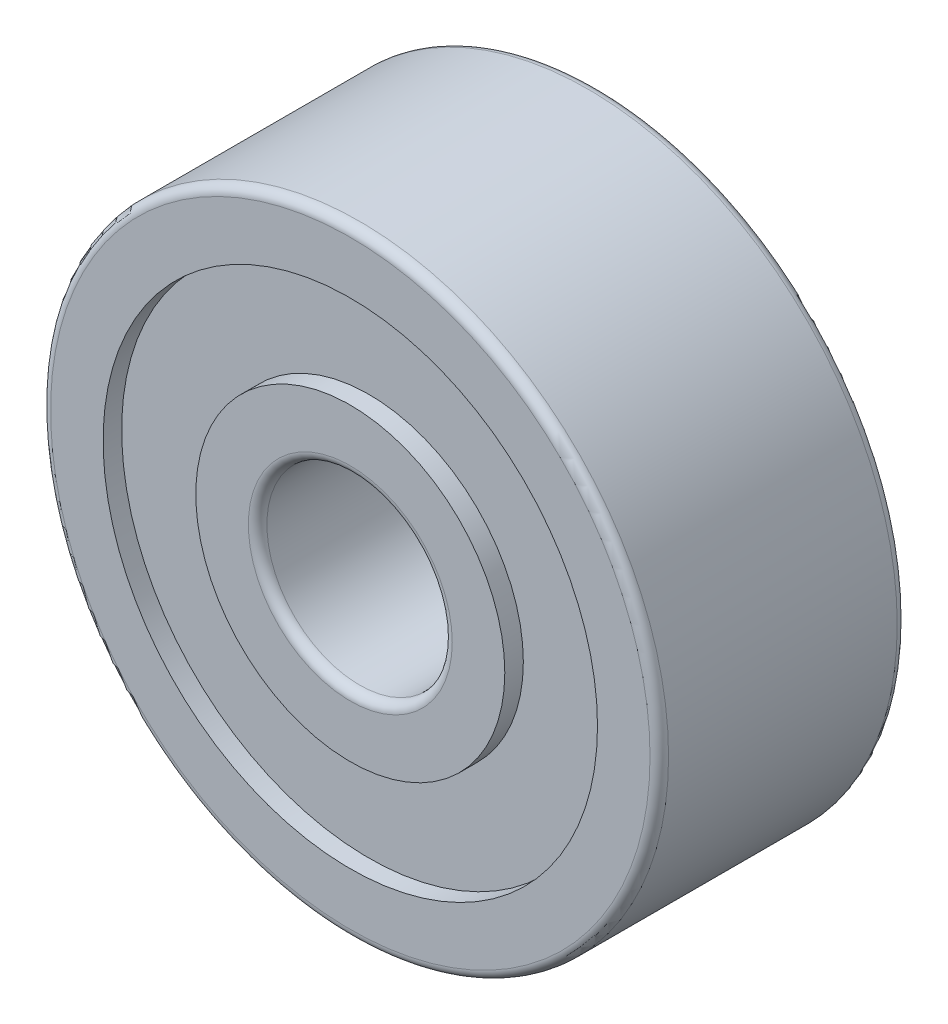
ISO-10303-21;
HEADER;
FILE_DESCRIPTION(('STEP AP214'),'2;1');
FILE_NAME('part.step','',(''),(''),'','','');
FILE_SCHEMA(('AUTOMOTIVE_DESIGN { 1 0 10303 214 1 1 1 1 }'));
ENDSEC;
DATA;
#1=APPLICATION_CONTEXT('core data for automotive mechanical design processes');
#2=APPLICATION_PROTOCOL_DEFINITION('international standard','automotive_design',2000,#1);
#3=PRODUCT_CONTEXT('',#1,'mechanical');
#4=PRODUCT('Part','Part','',(#3));
#5=PRODUCT_RELATED_PRODUCT_CATEGORY('part','',(#4));
#6=PRODUCT_DEFINITION_FORMATION('','',#4);
#7=PRODUCT_DEFINITION_CONTEXT('part definition',#1,'design');
#8=PRODUCT_DEFINITION('design','',#6,#7);
#9=PRODUCT_DEFINITION_SHAPE('','',#8);
#10=(LENGTH_UNIT() NAMED_UNIT(*) SI_UNIT(.MILLI.,.METRE.));
#11=(NAMED_UNIT(*) PLANE_ANGLE_UNIT() SI_UNIT($,.RADIAN.));
#12=(NAMED_UNIT(*) SI_UNIT($,.STERADIAN.) SOLID_ANGLE_UNIT());
#13=UNCERTAINTY_MEASURE_WITH_UNIT(LENGTH_MEASURE(1.E-05),#10,'distance_accuracy_value','');
#14=(GEOMETRIC_REPRESENTATION_CONTEXT(3) GLOBAL_UNCERTAINTY_ASSIGNED_CONTEXT((#13)) GLOBAL_UNIT_ASSIGNED_CONTEXT((#10,
#11,#12)) REPRESENTATION_CONTEXT('',''));
#15=CARTESIAN_POINT('',(0.,0.,0.));
#16=DIRECTION('',(0.,0.,1.));
#17=DIRECTION('',(1.,0.,0.));
#18=AXIS2_PLACEMENT_3D('',#15,#16,#17);
#19=CARTESIAN_POINT('',(-407.651902973959,139.372619686356,-4.));
#20=DIRECTION('',(0.,0.,1.));
#21=DIRECTION('',(1.,0.,0.));
#22=AXIS2_PLACEMENT_3D('',#19,#20,#21);
#23=PLANE('',#22);
#24=CARTESIAN_POINT('',(-407.651902973959,139.372619686356,-4.));
#25=DIRECTION('',(0.,0.,1.));
#26=DIRECTION('',(1.,0.,0.));
#27=AXIS2_PLACEMENT_3D('',#24,#25,#26);
#28=CIRCLE('',#27,1.65000000000002);
#29=CARTESIAN_POINT('',(-406.001902973959,139.372619686356,-4.));
#30=VERTEX_POINT('',#29);
#31=EDGE_CURVE('E64',#30,#30,#28,.T.);
#32=ORIENTED_EDGE('',*,*,#31,.T.);
#33=EDGE_LOOP('',(#32));
#34=FACE_BOUND('',#33,.T.);
#35=CARTESIAN_POINT('',(-407.651902973959,139.372619686356,-4.));
#36=DIRECTION('',(0.,0.,1.));
#37=DIRECTION('',(1.,0.,0.));
#38=AXIS2_PLACEMENT_3D('',#35,#36,#37);
#39=CIRCLE('',#38,2.50000000000002);
#40=CARTESIAN_POINT('',(-405.151902973959,139.372619686356,-4.));
#41=VERTEX_POINT('',#40);
#42=EDGE_CURVE('E86',#41,#41,#39,.T.);
#43=ORIENTED_EDGE('',*,*,#42,.F.);
#44=EDGE_LOOP('',(#43));
#45=FACE_BOUND('',#44,.T.);
#46=ADVANCED_FACE('F35',(#34,#45),#23,.F.);
#47=CARTESIAN_POINT('',(-407.651902973959,139.372619686356,0.));
#48=DIRECTION('',(0.,0.,1.));
#49=DIRECTION('',(1.,0.,0.));
#50=AXIS2_PLACEMENT_3D('',#47,#48,#49);
#51=PLANE('',#50);
#52=CARTESIAN_POINT('',(-407.651902973959,139.372619686356,0.));
#53=DIRECTION('',(0.,0.,1.));
#54=DIRECTION('',(1.,0.,0.));
#55=AXIS2_PLACEMENT_3D('',#52,#53,#54);
#56=CIRCLE('',#55,1.65000000000002);
#57=CARTESIAN_POINT('',(-406.001902973959,139.372619686356,0.));
#58=VERTEX_POINT('',#57);
#59=EDGE_CURVE('E55',#58,#58,#56,.F.);
#60=ORIENTED_EDGE('',*,*,#59,.T.);
#61=EDGE_LOOP('',(#60));
#62=FACE_BOUND('',#61,.T.);
#63=CARTESIAN_POINT('',(-407.651902973959,139.372619686356,0.));
#64=DIRECTION('',(0.,0.,1.));
#65=DIRECTION('',(1.,0.,0.));
#66=AXIS2_PLACEMENT_3D('',#63,#64,#65);
#67=CIRCLE('',#66,2.50000000000002);
#68=CARTESIAN_POINT('',(-405.151902973959,139.372619686356,0.));
#69=VERTEX_POINT('',#68);
#70=EDGE_CURVE('E74',#69,#69,#67,.T.);
#71=ORIENTED_EDGE('',*,*,#70,.T.);
#72=EDGE_LOOP('',(#71));
#73=FACE_BOUND('',#72,.T.);
#74=ADVANCED_FACE('F103',(#62,#73),#51,.T.);
#75=CARTESIAN_POINT('',(-407.651902973959,139.372619686356,-4.));
#76=DIRECTION('',(0.,0.,1.));
#77=DIRECTION('',(1.,0.,0.));
#78=AXIS2_PLACEMENT_3D('',#75,#76,#77);
#79=CYLINDRICAL_SURFACE('',#78,5.00000000000005);
#80=CARTESIAN_POINT('',(-407.651902973959,139.372619686356,-3.85));
#81=DIRECTION('',(0.,0.,1.));
#82=DIRECTION('',(1.,0.,0.));
#83=AXIS2_PLACEMENT_3D('',#80,#81,#82);
#84=CIRCLE('',#83,5.00000000000005);
#85=CARTESIAN_POINT('',(-402.651902973959,139.372619686356,-3.85));
#86=VERTEX_POINT('',#85);
#87=EDGE_CURVE('E46',#86,#86,#84,.T.);
#88=ORIENTED_EDGE('',*,*,#87,.T.);
#89=EDGE_LOOP('',(#88));
#90=FACE_BOUND('',#89,.T.);
#91=CARTESIAN_POINT('',(-407.651902973959,139.372619686356,-0.15));
#92=DIRECTION('',(0.,0.,1.));
#93=DIRECTION('',(1.,0.,0.));
#94=AXIS2_PLACEMENT_3D('',#91,#92,#93);
#95=CIRCLE('',#94,5.00000000000005);
#96=CARTESIAN_POINT('',(-402.651902973959,139.372619686356,-0.15));
#97=VERTEX_POINT('',#96);
#98=EDGE_CURVE('E50',#97,#97,#95,.F.);
#99=ORIENTED_EDGE('',*,*,#98,.T.);
#100=EDGE_LOOP('',(#99));
#101=FACE_BOUND('',#100,.T.);
#102=ADVANCED_FACE('F110',(#90,#101),#79,.T.);
#103=CARTESIAN_POINT('',(-407.651902973959,139.372619686356,-4.));
#104=DIRECTION('',(0.,0.,1.));
#105=DIRECTION('',(1.,0.,0.));
#106=AXIS2_PLACEMENT_3D('',#103,#104,#105);
#107=CIRCLE('',#106,4.85000000000004);
#108=CARTESIAN_POINT('',(-402.801902973959,139.372619686356,-4.));
#109=VERTEX_POINT('',#108);
#110=EDGE_CURVE('E42',#109,#109,#107,.F.);
#111=ORIENTED_EDGE('',*,*,#110,.T.);
#112=EDGE_LOOP('',(#111));
#113=FACE_BOUND('',#112,.T.);
#114=CARTESIAN_POINT('',(-407.651902973959,139.372619686356,-4.));
#115=DIRECTION('',(0.,0.,1.));
#116=DIRECTION('',(1.,0.,0.));
#117=AXIS2_PLACEMENT_3D('',#114,#115,#116);
#118=CIRCLE('',#117,3.99999999999999);
#119=CARTESIAN_POINT('',(-403.651902973959,139.372619686356,-4.));
#120=VERTEX_POINT('',#119);
#121=EDGE_CURVE('E80',#120,#120,#118,.T.);
#122=ORIENTED_EDGE('',*,*,#121,.T.);
#123=EDGE_LOOP('',(#122));
#124=FACE_BOUND('',#123,.T.);
#125=ADVANCED_FACE('F106',(#113,#124),#23,.F.);
#126=CARTESIAN_POINT('',(-407.651902973959,139.372619686356,0.));
#127=DIRECTION('',(0.,0.,1.));
#128=DIRECTION('',(1.,0.,0.));
#129=AXIS2_PLACEMENT_3D('',#126,#127,#128);
#130=CIRCLE('',#129,4.85000000000004);
#131=CARTESIAN_POINT('',(-402.801902973959,139.372619686356,0.));
#132=VERTEX_POINT('',#131);
#133=EDGE_CURVE('E10',#132,#132,#130,.T.);
#134=ORIENTED_EDGE('',*,*,#133,.T.);
#135=EDGE_LOOP('',(#134));
#136=FACE_BOUND('',#135,.T.);
#137=CARTESIAN_POINT('',(-407.651902973959,139.372619686356,0.));
#138=DIRECTION('',(0.,0.,1.));
#139=DIRECTION('',(1.,0.,0.));
#140=AXIS2_PLACEMENT_3D('',#137,#138,#139);
#141=CIRCLE('',#140,3.99999999999999);
#142=CARTESIAN_POINT('',(-403.651902973959,139.372619686356,0.));
#143=VERTEX_POINT('',#142);
#144=EDGE_CURVE('E68',#143,#143,#141,.T.);
#145=ORIENTED_EDGE('',*,*,#144,.F.);
#146=EDGE_LOOP('',(#145));
#147=FACE_BOUND('',#146,.T.);
#148=ADVANCED_FACE('F113',(#136,#147),#51,.T.);
#149=CARTESIAN_POINT('',(-407.651902973959,139.372619686356,-4.));
#150=DIRECTION('',(0.,0.,1.));
#151=DIRECTION('',(1.,0.,0.));
#152=AXIS2_PLACEMENT_3D('',#149,#150,#151);
#153=CYLINDRICAL_SURFACE('',#152,1.50000000000002);
#154=CARTESIAN_POINT('',(-407.651902973959,139.372619686356,-3.85));
#155=DIRECTION('',(0.,0.,1.));
#156=DIRECTION('',(1.,0.,0.));
#157=AXIS2_PLACEMENT_3D('',#154,#155,#156);
#158=CIRCLE('',#157,1.50000000000002);
#159=CARTESIAN_POINT('',(-406.151902973959,139.372619686356,-3.85));
#160=VERTEX_POINT('',#159);
#161=EDGE_CURVE('E58',#160,#160,#158,.F.);
#162=ORIENTED_EDGE('',*,*,#161,.T.);
#163=EDGE_LOOP('',(#162));
#164=FACE_BOUND('',#163,.T.);
#165=CARTESIAN_POINT('',(-407.651902973959,139.372619686356,-0.15));
#166=DIRECTION('',(0.,0.,1.));
#167=DIRECTION('',(1.,0.,0.));
#168=AXIS2_PLACEMENT_3D('',#165,#166,#167);
#169=CIRCLE('',#168,1.50000000000002);
#170=CARTESIAN_POINT('',(-406.151902973959,139.372619686356,-0.15));
#171=VERTEX_POINT('',#170);
#172=EDGE_CURVE('E61',#171,#171,#169,.T.);
#173=ORIENTED_EDGE('',*,*,#172,.T.);
#174=EDGE_LOOP('',(#173));
#175=FACE_BOUND('',#174,.T.);
#176=ADVANCED_FACE('F120',(#164,#175),#153,.F.);
#177=CARTESIAN_POINT('',(-407.651902973959,139.372619686356,-0.3));
#178=DIRECTION('',(0.,0.,1.));
#179=DIRECTION('',(1.,0.,0.));
#180=AXIS2_PLACEMENT_3D('',#177,#178,#179);
#181=CYLINDRICAL_SURFACE('',#180,3.99999999999999);
#182=CARTESIAN_POINT('',(-407.651902973959,139.372619686356,-0.3));
#183=DIRECTION('',(0.,0.,1.));
#184=DIRECTION('',(1.,0.,0.));
#185=AXIS2_PLACEMENT_3D('',#182,#183,#184);
#186=CIRCLE('',#185,3.99999999999999);
#187=CARTESIAN_POINT('',(-403.651902973959,139.372619686356,-0.3));
#188=VERTEX_POINT('',#187);
#189=EDGE_CURVE('E67',#188,#188,#186,.T.);
#190=ORIENTED_EDGE('',*,*,#189,.F.);
#191=EDGE_LOOP('',(#190));
#192=FACE_BOUND('',#191,.T.);
#193=ORIENTED_EDGE('',*,*,#144,.T.);
#194=EDGE_LOOP('',(#193));
#195=FACE_BOUND('',#194,.T.);
#196=ADVANCED_FACE('F142',(#192,#195),#181,.F.);
#197=CARTESIAN_POINT('',(-407.651902973959,139.372619686356,-0.3));
#198=DIRECTION('',(0.,0.,1.));
#199=DIRECTION('',(1.,0.,0.));
#200=AXIS2_PLACEMENT_3D('',#197,#198,#199);
#201=PLANE('',#200);
#202=CARTESIAN_POINT('',(-407.651902973959,139.372619686356,-0.3));
#203=DIRECTION('',(0.,0.,1.));
#204=DIRECTION('',(1.,0.,0.));
#205=AXIS2_PLACEMENT_3D('',#202,#203,#204);
#206=CIRCLE('',#205,2.50000000000002);
#207=CARTESIAN_POINT('',(-405.151902973959,139.372619686356,-0.3));
#208=VERTEX_POINT('',#207);
#209=EDGE_CURVE('E71',#208,#208,#206,.T.);
#210=ORIENTED_EDGE('',*,*,#209,.F.);
#211=EDGE_LOOP('',(#210));
#212=FACE_BOUND('',#211,.T.);
#213=ORIENTED_EDGE('',*,*,#189,.T.);
#214=EDGE_LOOP('',(#213));
#215=FACE_BOUND('',#214,.T.);
#216=ADVANCED_FACE('F138',(#212,#215),#201,.T.);
#217=CARTESIAN_POINT('',(-407.651902973959,139.372619686356,-0.3));
#218=DIRECTION('',(0.,0.,1.));
#219=DIRECTION('',(1.,0.,0.));
#220=AXIS2_PLACEMENT_3D('',#217,#218,#219);
#221=CYLINDRICAL_SURFACE('',#220,2.50000000000002);
#222=ORIENTED_EDGE('',*,*,#209,.T.);
#223=EDGE_LOOP('',(#222));
#224=FACE_BOUND('',#223,.T.);
#225=ORIENTED_EDGE('',*,*,#70,.F.);
#226=EDGE_LOOP('',(#225));
#227=FACE_BOUND('',#226,.T.);
#228=ADVANCED_FACE('F132',(#224,#227),#221,.T.);
#229=CARTESIAN_POINT('',(-407.651902973959,139.372619686356,-3.7));
#230=DIRECTION('',(0.,0.,1.));
#231=DIRECTION('',(1.,0.,0.));
#232=AXIS2_PLACEMENT_3D('',#229,#230,#231);
#233=PLANE('',#232);
#234=CARTESIAN_POINT('',(-407.651902973959,139.372619686356,-3.7));
#235=DIRECTION('',(0.,0.,1.));
#236=DIRECTION('',(1.,0.,0.));
#237=AXIS2_PLACEMENT_3D('',#234,#235,#236);
#238=CIRCLE('',#237,3.99999999999999);
#239=CARTESIAN_POINT('',(-403.651902973959,139.372619686356,-3.7));
#240=VERTEX_POINT('',#239);
#241=EDGE_CURVE('E77',#240,#240,#238,.T.);
#242=ORIENTED_EDGE('',*,*,#241,.F.);
#243=EDGE_LOOP('',(#242));
#244=FACE_BOUND('',#243,.T.);
#245=CARTESIAN_POINT('',(-407.651902973959,139.372619686356,-3.7));
#246=DIRECTION('',(0.,0.,1.));
#247=DIRECTION('',(1.,0.,0.));
#248=AXIS2_PLACEMENT_3D('',#245,#246,#247);
#249=CIRCLE('',#248,2.50000000000002);
#250=CARTESIAN_POINT('',(-405.151902973959,139.372619686356,-3.7));
#251=VERTEX_POINT('',#250);
#252=EDGE_CURVE('E83',#251,#251,#249,.T.);
#253=ORIENTED_EDGE('',*,*,#252,.T.);
#254=EDGE_LOOP('',(#253));
#255=FACE_BOUND('',#254,.T.);
#256=ADVANCED_FACE('F92',(#244,#255),#233,.F.);
#257=CARTESIAN_POINT('',(-407.651902973959,139.372619686356,-3.7));
#258=DIRECTION('',(0.,0.,-1.));
#259=DIRECTION('',(-1.,0.,0.));
#260=AXIS2_PLACEMENT_3D('',#257,#258,#259);
#261=CYLINDRICAL_SURFACE('',#260,3.99999999999999);
#262=ORIENTED_EDGE('',*,*,#241,.T.);
#263=EDGE_LOOP('',(#262));
#264=FACE_BOUND('',#263,.T.);
#265=ORIENTED_EDGE('',*,*,#121,.F.);
#266=EDGE_LOOP('',(#265));
#267=FACE_BOUND('',#266,.T.);
#268=ADVANCED_FACE('F98',(#264,#267),#261,.F.);
#269=CARTESIAN_POINT('',(-407.651902973959,139.372619686356,-3.7));
#270=DIRECTION('',(0.,0.,-1.));
#271=DIRECTION('',(-1.,0.,0.));
#272=AXIS2_PLACEMENT_3D('',#269,#270,#271);
#273=CYLINDRICAL_SURFACE('',#272,2.50000000000002);
#274=ORIENTED_EDGE('',*,*,#252,.F.);
#275=EDGE_LOOP('',(#274));
#276=FACE_BOUND('',#275,.T.);
#277=ORIENTED_EDGE('',*,*,#42,.T.);
#278=EDGE_LOOP('',(#277));
#279=FACE_BOUND('',#278,.T.);
#280=ADVANCED_FACE('F94',(#276,#279),#273,.T.);
#281=CARTESIAN_POINT('',(-407.651902973959,139.372619686356,-3.85));
#282=DIRECTION('',(0.,0.,1.));
#283=DIRECTION('',(1.,0.,0.));
#284=AXIS2_PLACEMENT_3D('',#281,#282,#283);
#285=TOROIDAL_SURFACE('',#284,1.65000000000002,0.15);
#286=ORIENTED_EDGE('',*,*,#161,.F.);
#287=EDGE_LOOP('',(#286));
#288=FACE_BOUND('',#287,.T.);
#289=ORIENTED_EDGE('',*,*,#31,.F.);
#290=EDGE_LOOP('',(#289));
#291=FACE_BOUND('',#290,.T.);
#292=ADVANCED_FACE('F97',(#288,#291),#285,.T.);
#293=CARTESIAN_POINT('',(-407.651902973959,139.372619686356,-0.15));
#294=DIRECTION('',(0.,0.,1.));
#295=DIRECTION('',(1.,0.,0.));
#296=AXIS2_PLACEMENT_3D('',#293,#294,#295);
#297=TOROIDAL_SURFACE('',#296,1.65000000000002,0.15);
#298=ORIENTED_EDGE('',*,*,#59,.F.);
#299=EDGE_LOOP('',(#298));
#300=FACE_BOUND('',#299,.T.);
#301=ORIENTED_EDGE('',*,*,#172,.F.);
#302=EDGE_LOOP('',(#301));
#303=FACE_BOUND('',#302,.T.);
#304=ADVANCED_FACE('F154',(#300,#303),#297,.T.);
#305=CARTESIAN_POINT('',(-407.651902973959,139.372619686356,-3.85));
#306=DIRECTION('',(0.,0.,1.));
#307=DIRECTION('',(1.,0.,0.));
#308=AXIS2_PLACEMENT_3D('',#305,#306,#307);
#309=TOROIDAL_SURFACE('',#308,4.85000000000004,0.15);
#310=ORIENTED_EDGE('',*,*,#110,.F.);
#311=EDGE_LOOP('',(#310));
#312=FACE_BOUND('',#311,.T.);
#313=ORIENTED_EDGE('',*,*,#87,.F.);
#314=EDGE_LOOP('',(#313));
#315=FACE_BOUND('',#314,.T.);
#316=ADVANCED_FACE('F156',(#312,#315),#309,.T.);
#317=CARTESIAN_POINT('',(-407.651902973959,139.372619686356,-0.15));
#318=DIRECTION('',(0.,0.,1.));
#319=DIRECTION('',(1.,0.,0.));
#320=AXIS2_PLACEMENT_3D('',#317,#318,#319);
#321=TOROIDAL_SURFACE('',#320,4.85000000000004,0.15);
#322=ORIENTED_EDGE('',*,*,#98,.F.);
#323=EDGE_LOOP('',(#322));
#324=FACE_BOUND('',#323,.T.);
#325=ORIENTED_EDGE('',*,*,#133,.F.);
#326=EDGE_LOOP('',(#325));
#327=FACE_BOUND('',#326,.T.);
#328=ADVANCED_FACE('F37',(#324,#327),#321,.T.);
#329=CLOSED_SHELL('',(#46,#74,#102,#125,#148,#176,#196,#216,#228,#256,#268,#280,#292,#304,#316,#328));
#330=MANIFOLD_SOLID_BREP('B2',#329);
#331=ADVANCED_BREP_SHAPE_REPRESENTATION('',(#18,#330),#14);
#332=SHAPE_DEFINITION_REPRESENTATION(#9,#331);
ENDSEC;
END-ISO-10303-21;
